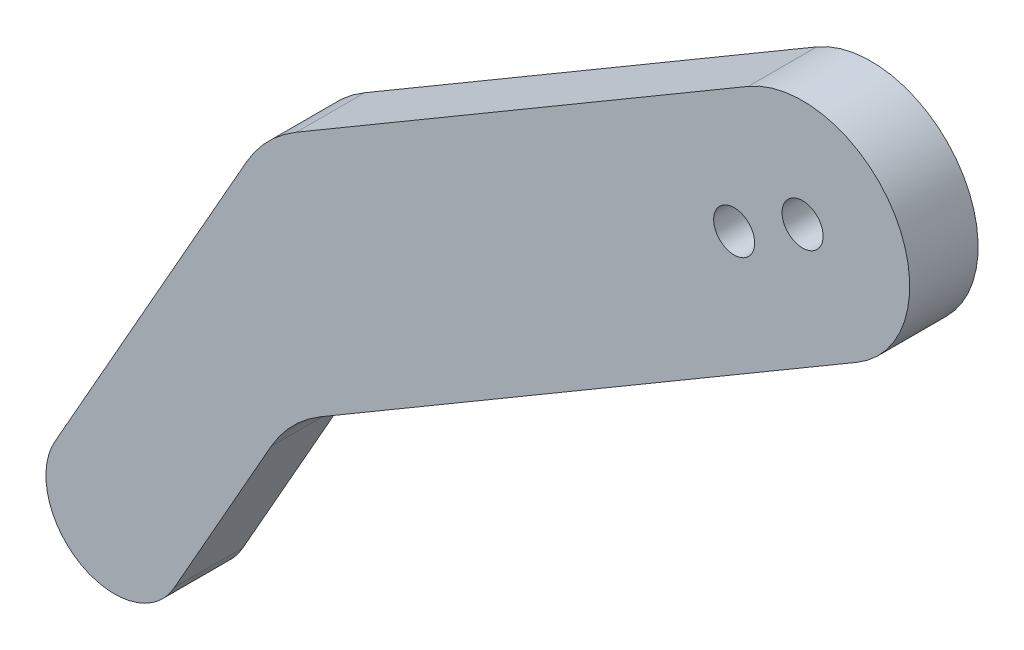
ISO-10303-21;
HEADER;
FILE_DESCRIPTION(('STEP AP214'),'2;1');
FILE_NAME('part.step','',(''),(''),'','','');
FILE_SCHEMA(('AUTOMOTIVE_DESIGN { 1 0 10303 214 1 1 1 1 }'));
ENDSEC;
DATA;
#1=APPLICATION_CONTEXT('core data for automotive mechanical design processes');
#2=APPLICATION_PROTOCOL_DEFINITION('international standard','automotive_design',2000,#1);
#3=PRODUCT_CONTEXT('',#1,'mechanical');
#4=PRODUCT('Part','Part','',(#3));
#5=PRODUCT_RELATED_PRODUCT_CATEGORY('part','',(#4));
#6=PRODUCT_DEFINITION_FORMATION('','',#4);
#7=PRODUCT_DEFINITION_CONTEXT('part definition',#1,'design');
#8=PRODUCT_DEFINITION('design','',#6,#7);
#9=PRODUCT_DEFINITION_SHAPE('','',#8);
#10=(LENGTH_UNIT() NAMED_UNIT(*) SI_UNIT(.MILLI.,.METRE.));
#11=(NAMED_UNIT(*) PLANE_ANGLE_UNIT() SI_UNIT($,.RADIAN.));
#12=(NAMED_UNIT(*) SI_UNIT($,.STERADIAN.) SOLID_ANGLE_UNIT());
#13=UNCERTAINTY_MEASURE_WITH_UNIT(LENGTH_MEASURE(1.E-05),#10,'distance_accuracy_value','');
#14=(GEOMETRIC_REPRESENTATION_CONTEXT(3) GLOBAL_UNCERTAINTY_ASSIGNED_CONTEXT((#13)) GLOBAL_UNIT_ASSIGNED_CONTEXT((#10,
#11,#12)) REPRESENTATION_CONTEXT('',''));
#15=CARTESIAN_POINT('',(0.,0.,0.));
#16=DIRECTION('',(0.,0.,1.));
#17=DIRECTION('',(1.,0.,0.));
#18=AXIS2_PLACEMENT_3D('',#15,#16,#17);
#19=CARTESIAN_POINT('',(8.69918007203384,-4.93196371380907,5.));
#20=DIRECTION('',(-0.869918007203384,0.493196371380907,0.));
#21=DIRECTION('',(-0.493196371380907,-0.869918007203384,0.));
#22=AXIS2_PLACEMENT_3D('',#19,#20,#21);
#23=PLANE('',#22);
#24=DIRECTION('',(0.493196371380907,0.869918007203384,0.));
#25=VECTOR('',#24,1.);
#26=CARTESIAN_POINT('',(8.69918007203384,-4.93196371380907,0.));
#27=LINE('',#26,#25);
#28=CARTESIAN_POINT('',(8.69918007203384,-4.93196371380907,0.));
#29=VERTEX_POINT('',#28);
#30=CARTESIAN_POINT('',(15.7620026912945,7.52570413353407,0.));
#31=VERTEX_POINT('',#30);
#32=EDGE_CURVE('E136',#29,#31,#27,.T.);
#33=ORIENTED_EDGE('',*,*,#32,.T.);
#34=DIRECTION('',(0.,0.,-1.));
#35=VECTOR('',#34,1.);
#36=CARTESIAN_POINT('',(15.7620026912945,7.52570413353407,5.));
#37=LINE('',#36,#35);
#38=CARTESIAN_POINT('',(15.7620026912945,7.52570413353407,5.));
#39=VERTEX_POINT('',#38);
#40=EDGE_CURVE('E11',#39,#31,#37,.T.);
#41=ORIENTED_EDGE('',*,*,#40,.F.);
#42=DIRECTION('',(0.493196371380907,0.869918007203384,0.));
#43=VECTOR('',#42,1.);
#44=CARTESIAN_POINT('',(8.69918007203384,-4.93196371380907,5.));
#45=LINE('',#44,#43);
#46=CARTESIAN_POINT('',(8.69918007203384,-4.93196371380907,5.));
#47=VERTEX_POINT('',#46);
#48=EDGE_CURVE('E155',#47,#39,#45,.T.);
#49=ORIENTED_EDGE('',*,*,#48,.F.);
#50=DIRECTION('',(0.,0.,-1.));
#51=VECTOR('',#50,1.);
#52=CARTESIAN_POINT('',(8.69918007203384,-4.93196371380907,5.));
#53=LINE('',#52,#51);
#54=EDGE_CURVE('E132',#47,#29,#53,.T.);
#55=ORIENTED_EDGE('',*,*,#54,.T.);
#56=EDGE_LOOP('',(#33,#41,#49,#55));
#57=FACE_BOUND('',#56,.T.);
#58=ADVANCED_FACE('F39',(#57),#23,.F.);
#59=CARTESIAN_POINT('',(24.4611827633284,2.593740419725,5.));
#60=DIRECTION('',(0.,0.,-1.));
#61=DIRECTION('',(-1.,0.,0.));
#62=AXIS2_PLACEMENT_3D('',#59,#60,#61);
#63=CYLINDRICAL_SURFACE('',#62,10.);
#64=CARTESIAN_POINT('',(24.4611827633284,2.593740419725,0.));
#65=DIRECTION('',(0.,0.,1.));
#66=DIRECTION('',(1.,0.,0.));
#67=AXIS2_PLACEMENT_3D('',#64,#65,#66);
#68=CIRCLE('',#67,10.);
#69=CARTESIAN_POINT('',(19.3934536857563,11.2145363224436,0.));
#70=VERTEX_POINT('',#69);
#71=EDGE_CURVE('E139',#31,#70,#68,.F.);
#72=ORIENTED_EDGE('',*,*,#71,.T.);
#73=DIRECTION('',(0.,0.,-1.));
#74=VECTOR('',#73,1.);
#75=CARTESIAN_POINT('',(19.3934536857563,11.2145363224436,5.));
#76=LINE('',#75,#74);
#77=CARTESIAN_POINT('',(19.3934536857563,11.2145363224436,5.));
#78=VERTEX_POINT('',#77);
#79=EDGE_CURVE('E48',#78,#70,#76,.T.);
#80=ORIENTED_EDGE('',*,*,#79,.F.);
#81=CARTESIAN_POINT('',(24.4611827633284,2.593740419725,5.));
#82=DIRECTION('',(0.,0.,1.));
#83=DIRECTION('',(1.,0.,0.));
#84=AXIS2_PLACEMENT_3D('',#81,#82,#83);
#85=CIRCLE('',#84,10.);
#86=EDGE_CURVE('E96',#39,#78,#85,.F.);
#87=ORIENTED_EDGE('',*,*,#86,.F.);
#88=ORIENTED_EDGE('',*,*,#40,.T.);
#89=EDGE_LOOP('',(#72,#80,#87,#88));
#90=FACE_BOUND('',#89,.T.);
#91=ADVANCED_FACE('F205',(#90),#63,.F.);
#92=CARTESIAN_POINT('',(0.0812124047382273,-0.138151735284289,5.));
#93=DIRECTION('',(-0.50677290775721,0.862079590271863,0.));
#94=DIRECTION('',(-0.862079590271862,-0.50677290775721,0.));
#95=AXIS2_PLACEMENT_3D('',#92,#93,#94);
#96=PLANE('',#95);
#97=DIRECTION('',(0.862079590271863,0.50677290775721,0.));
#98=VECTOR('',#97,1.);
#99=CARTESIAN_POINT('',(0.0812124047382273,-0.138151735284289,0.));
#100=LINE('',#99,#98);
#101=CARTESIAN_POINT('',(58.5705431889295,34.2447620568523,0.));
#102=VERTEX_POINT('',#101);
#103=EDGE_CURVE('E142',#70,#102,#100,.T.);
#104=ORIENTED_EDGE('',*,*,#103,.T.);
#105=DIRECTION('',(0.,0.,-1.));
#106=VECTOR('',#105,1.);
#107=CARTESIAN_POINT('',(58.5705431889295,34.2447620568523,5.));
#108=LINE('',#107,#106);
#109=CARTESIAN_POINT('',(58.5705431889295,34.2447620568523,5.));
#110=VERTEX_POINT('',#109);
#111=EDGE_CURVE('E161',#110,#102,#108,.T.);
#112=ORIENTED_EDGE('',*,*,#111,.F.);
#113=DIRECTION('',(0.862079590271863,0.50677290775721,0.));
#114=VECTOR('',#113,1.);
#115=CARTESIAN_POINT('',(0.0812124047382273,-0.138151735284289,5.));
#116=LINE('',#115,#114);
#117=EDGE_CURVE('E178',#78,#110,#116,.T.);
#118=ORIENTED_EDGE('',*,*,#117,.F.);
#119=ORIENTED_EDGE('',*,*,#79,.T.);
#120=EDGE_LOOP('',(#104,#112,#118,#119));
#121=FACE_BOUND('',#120,.T.);
#122=ADVANCED_FACE('F209',(#121),#96,.F.);
#123=CARTESIAN_POINT('',(54.602446951442,40.9949547491014,5.));
#124=DIRECTION('',(0.,0.,-1.));
#125=DIRECTION('',(-1.,0.,0.));
#126=AXIS2_PLACEMENT_3D('',#123,#124,#125);
#127=CYLINDRICAL_SURFACE('',#126,7.8301270189222);
#128=CARTESIAN_POINT('',(54.602446951442,40.9949547491014,0.));
#129=DIRECTION('',(0.,0.,1.));
#130=DIRECTION('',(1.,0.,0.));
#131=AXIS2_PLACEMENT_3D('',#128,#129,#130);
#132=CIRCLE('',#131,7.8301270189222);
#133=CARTESIAN_POINT('',(50.6343507139545,47.7451474413505,0.));
#134=VERTEX_POINT('',#133);
#135=EDGE_CURVE('E145',#134,#102,#132,.F.);
#136=ORIENTED_EDGE('',*,*,#135,.F.);
#137=DIRECTION('',(0.,0.,-1.));
#138=VECTOR('',#137,1.);
#139=CARTESIAN_POINT('',(50.6343507139545,47.7451474413505,5.));
#140=LINE('',#139,#138);
#141=CARTESIAN_POINT('',(50.6343507139545,47.7451474413505,5.));
#142=VERTEX_POINT('',#141);
#143=EDGE_CURVE('E159',#142,#134,#140,.T.);
#144=ORIENTED_EDGE('',*,*,#143,.F.);
#145=CARTESIAN_POINT('',(54.602446951442,40.9949547491014,5.));
#146=DIRECTION('',(0.,0.,1.));
#147=DIRECTION('',(1.,0.,0.));
#148=AXIS2_PLACEMENT_3D('',#145,#146,#147);
#149=CIRCLE('',#148,7.8301270189222);
#150=EDGE_CURVE('E180',#142,#110,#149,.F.);
#151=ORIENTED_EDGE('',*,*,#150,.T.);
#152=ORIENTED_EDGE('',*,*,#111,.T.);
#153=EDGE_LOOP('',(#136,#144,#151,#152));
#154=FACE_BOUND('',#153,.T.);
#155=ADVANCED_FACE('F213',(#154),#127,.T.);
#156=CARTESIAN_POINT('',(-7.85498007023677,13.3622336492139,5.));
#157=DIRECTION('',(-0.50677290775721,0.862079590271862,0.));
#158=DIRECTION('',(-0.862079590271862,-0.50677290775721,0.));
#159=AXIS2_PLACEMENT_3D('',#156,#157,#158);
#160=PLANE('',#159);
#161=DIRECTION('',(0.862079590271862,0.50677290775721,0.));
#162=VECTOR('',#161,1.);
#163=CARTESIAN_POINT('',(-7.85498007023677,13.3622336492139,0.));
#164=LINE('',#163,#162);
#165=CARTESIAN_POINT('',(17.5990228130551,28.3253521371001,0.));
#166=VERTEX_POINT('',#165);
#167=EDGE_CURVE('E148',#166,#134,#164,.T.);
#168=ORIENTED_EDGE('',*,*,#167,.F.);
#169=DIRECTION('',(0.,0.,-1.));
#170=VECTOR('',#169,1.);
#171=CARTESIAN_POINT('',(17.5990228130551,28.3253521371001,5.));
#172=LINE('',#171,#170);
#173=CARTESIAN_POINT('',(17.5990228130551,28.3253521371001,5.));
#174=VERTEX_POINT('',#173);
#175=EDGE_CURVE('E121',#174,#166,#172,.T.);
#176=ORIENTED_EDGE('',*,*,#175,.F.);
#177=DIRECTION('',(0.862079590271862,0.50677290775721,0.));
#178=VECTOR('',#177,1.);
#179=CARTESIAN_POINT('',(-7.85498007023677,13.3622336492139,5.));
#180=LINE('',#179,#178);
#181=EDGE_CURVE('E128',#174,#142,#180,.T.);
#182=ORIENTED_EDGE('',*,*,#181,.T.);
#183=ORIENTED_EDGE('',*,*,#143,.T.);
#184=EDGE_LOOP('',(#168,#176,#182,#183));
#185=FACE_BOUND('',#184,.T.);
#186=ADVANCED_FACE('F184',(#185),#160,.T.);
#187=CARTESIAN_POINT('',(22.6667518906272,19.7045562343814,5.));
#188=DIRECTION('',(0.,0.,-1.));
#189=DIRECTION('',(-1.,0.,0.));
#190=AXIS2_PLACEMENT_3D('',#187,#188,#189);
#191=CYLINDRICAL_SURFACE('',#190,10.);
#192=CARTESIAN_POINT('',(22.6667518906272,19.7045562343814,0.));
#193=DIRECTION('',(0.,0.,1.));
#194=DIRECTION('',(1.,0.,0.));
#195=AXIS2_PLACEMENT_3D('',#192,#193,#194);
#196=CIRCLE('',#195,10.);
#197=CARTESIAN_POINT('',(13.9675718185934,24.6365199481905,0.));
#198=VERTEX_POINT('',#197);
#199=EDGE_CURVE('E116',#198,#166,#196,.F.);
#200=ORIENTED_EDGE('',*,*,#199,.F.);
#201=DIRECTION('',(0.,0.,-1.));
#202=VECTOR('',#201,1.);
#203=CARTESIAN_POINT('',(13.9675718185934,24.6365199481905,5.));
#204=LINE('',#203,#202);
#205=CARTESIAN_POINT('',(13.9675718185934,24.6365199481905,5.));
#206=VERTEX_POINT('',#205);
#207=EDGE_CURVE('E111',#206,#198,#204,.T.);
#208=ORIENTED_EDGE('',*,*,#207,.F.);
#209=CARTESIAN_POINT('',(22.6667518906272,19.7045562343814,5.));
#210=DIRECTION('',(0.,0.,1.));
#211=DIRECTION('',(1.,0.,0.));
#212=AXIS2_PLACEMENT_3D('',#209,#210,#211);
#213=CIRCLE('',#212,10.);
#214=EDGE_CURVE('E114',#206,#174,#213,.F.);
#215=ORIENTED_EDGE('',*,*,#214,.T.);
#216=ORIENTED_EDGE('',*,*,#175,.T.);
#217=EDGE_LOOP('',(#200,#208,#215,#216));
#218=FACE_BOUND('',#217,.T.);
#219=ADVANCED_FACE('F113',(#218),#191,.T.);
#220=CARTESIAN_POINT('',(0.,0.,5.));
#221=DIRECTION('',(-0.869918007203384,0.493196371380907,0.));
#222=DIRECTION('',(-0.493196371380907,-0.869918007203384,0.));
#223=AXIS2_PLACEMENT_3D('',#220,#221,#222);
#224=PLANE('',#223);
#225=DIRECTION('',(0.493196371380907,0.869918007203384,0.));
#226=VECTOR('',#225,1.);
#227=CARTESIAN_POINT('',(0.,0.,0.));
#228=LINE('',#227,#226);
#229=CARTESIAN_POINT('',(0.,0.,0.));
#230=VERTEX_POINT('',#229);
#231=EDGE_CURVE('E152',#230,#198,#228,.T.);
#232=ORIENTED_EDGE('',*,*,#231,.F.);
#233=DIRECTION('',(0.,0.,-1.));
#234=VECTOR('',#233,1.);
#235=CARTESIAN_POINT('',(0.,0.,5.));
#236=LINE('',#235,#234);
#237=CARTESIAN_POINT('',(0.,0.,5.));
#238=VERTEX_POINT('',#237);
#239=EDGE_CURVE('E85',#238,#230,#236,.T.);
#240=ORIENTED_EDGE('',*,*,#239,.F.);
#241=DIRECTION('',(0.493196371380907,0.869918007203384,0.));
#242=VECTOR('',#241,1.);
#243=CARTESIAN_POINT('',(0.,0.,5.));
#244=LINE('',#243,#242);
#245=EDGE_CURVE('E125',#238,#206,#244,.T.);
#246=ORIENTED_EDGE('',*,*,#245,.T.);
#247=ORIENTED_EDGE('',*,*,#207,.T.);
#248=EDGE_LOOP('',(#232,#240,#246,#247));
#249=FACE_BOUND('',#248,.T.);
#250=ADVANCED_FACE('F130',(#249),#224,.T.);
#251=CARTESIAN_POINT('',(4.30532765313558,-2.54405348545767,5.));
#252=DIRECTION('',(0.,0.,-1.));
#253=DIRECTION('',(-1.,0.,0.));
#254=AXIS2_PLACEMENT_3D('',#251,#252,#253);
#255=CYLINDRICAL_SURFACE('',#254,5.00080536891042);
#256=CARTESIAN_POINT('',(4.30532765313558,-2.54405348545767,0.));
#257=DIRECTION('',(0.,0.,1.));
#258=DIRECTION('',(1.,0.,0.));
#259=AXIS2_PLACEMENT_3D('',#256,#257,#258);
#260=CIRCLE('',#259,5.00080536891042);
#261=EDGE_CURVE('E88',#230,#29,#260,.T.);
#262=ORIENTED_EDGE('',*,*,#261,.T.);
#263=ORIENTED_EDGE('',*,*,#54,.F.);
#264=CARTESIAN_POINT('',(4.30532765313558,-2.54405348545767,5.));
#265=DIRECTION('',(0.,0.,1.));
#266=DIRECTION('',(1.,0.,0.));
#267=AXIS2_PLACEMENT_3D('',#264,#265,#266);
#268=CIRCLE('',#267,5.00080536891042);
#269=EDGE_CURVE('E57',#238,#47,#268,.T.);
#270=ORIENTED_EDGE('',*,*,#269,.F.);
#271=ORIENTED_EDGE('',*,*,#239,.T.);
#272=EDGE_LOOP('',(#262,#263,#270,#271));
#273=FACE_BOUND('',#272,.T.);
#274=ADVANCED_FACE('F193',(#273),#255,.T.);
#275=CARTESIAN_POINT('',(0.,0.,5.));
#276=DIRECTION('',(0.,0.,1.));
#277=DIRECTION('',(1.,0.,0.));
#278=AXIS2_PLACEMENT_3D('',#275,#276,#277);
#279=PLANE('',#278);
#280=CARTESIAN_POINT('',(49.602446951442,38.0557081094878,5.));
#281=DIRECTION('',(0.,0.,1.));
#282=DIRECTION('',(1.,0.,0.));
#283=AXIS2_PLACEMENT_3D('',#280,#281,#282);
#284=CIRCLE('',#283,1.5);
#285=CARTESIAN_POINT('',(51.102446951442,38.0557081094878,5.));
#286=VERTEX_POINT('',#285);
#287=EDGE_CURVE('E173',#286,#286,#284,.T.);
#288=ORIENTED_EDGE('',*,*,#287,.F.);
#289=EDGE_LOOP('',(#288));
#290=FACE_BOUND('',#289,.T.);
#291=CARTESIAN_POINT('',(54.602446951442,40.9949547491014,5.));
#292=DIRECTION('',(0.,0.,1.));
#293=DIRECTION('',(1.,0.,0.));
#294=AXIS2_PLACEMENT_3D('',#291,#292,#293);
#295=CIRCLE('',#294,1.5);
#296=CARTESIAN_POINT('',(56.102446951442,40.9949547491014,5.));
#297=VERTEX_POINT('',#296);
#298=EDGE_CURVE('E165',#297,#297,#295,.T.);
#299=ORIENTED_EDGE('',*,*,#298,.F.);
#300=EDGE_LOOP('',(#299));
#301=FACE_BOUND('',#300,.T.);
#302=ORIENTED_EDGE('',*,*,#48,.T.);
#303=ORIENTED_EDGE('',*,*,#86,.T.);
#304=ORIENTED_EDGE('',*,*,#117,.T.);
#305=ORIENTED_EDGE('',*,*,#150,.F.);
#306=ORIENTED_EDGE('',*,*,#181,.F.);
#307=ORIENTED_EDGE('',*,*,#214,.F.);
#308=ORIENTED_EDGE('',*,*,#245,.F.);
#309=ORIENTED_EDGE('',*,*,#269,.T.);
#310=EDGE_LOOP('',(#302,#303,#304,#305,#306,#307,#308,#309));
#311=FACE_BOUND('',#310,.T.);
#312=ADVANCED_FACE('F124',(#290,#301,#311),#279,.T.);
#313=CARTESIAN_POINT('',(0.,0.,0.));
#314=DIRECTION('',(0.,0.,1.));
#315=DIRECTION('',(1.,0.,0.));
#316=AXIS2_PLACEMENT_3D('',#313,#314,#315);
#317=PLANE('',#316);
#318=CARTESIAN_POINT('',(49.602446951442,38.0557081094878,0.));
#319=DIRECTION('',(0.,0.,1.));
#320=DIRECTION('',(1.,0.,0.));
#321=AXIS2_PLACEMENT_3D('',#318,#319,#320);
#322=CIRCLE('',#321,1.5);
#323=CARTESIAN_POINT('',(51.102446951442,38.0557081094878,0.));
#324=VERTEX_POINT('',#323);
#325=EDGE_CURVE('E42',#324,#324,#322,.T.);
#326=ORIENTED_EDGE('',*,*,#325,.T.);
#327=EDGE_LOOP('',(#326));
#328=FACE_BOUND('',#327,.T.);
#329=CARTESIAN_POINT('',(54.602446951442,40.9949547491014,0.));
#330=DIRECTION('',(0.,0.,1.));
#331=DIRECTION('',(1.,0.,0.));
#332=AXIS2_PLACEMENT_3D('',#329,#330,#331);
#333=CIRCLE('',#332,1.5);
#334=CARTESIAN_POINT('',(56.102446951442,40.9949547491014,0.));
#335=VERTEX_POINT('',#334);
#336=EDGE_CURVE('E140',#335,#335,#333,.T.);
#337=ORIENTED_EDGE('',*,*,#336,.T.);
#338=EDGE_LOOP('',(#337));
#339=FACE_BOUND('',#338,.T.);
#340=ORIENTED_EDGE('',*,*,#32,.F.);
#341=ORIENTED_EDGE('',*,*,#261,.F.);
#342=ORIENTED_EDGE('',*,*,#231,.T.);
#343=ORIENTED_EDGE('',*,*,#199,.T.);
#344=ORIENTED_EDGE('',*,*,#167,.T.);
#345=ORIENTED_EDGE('',*,*,#135,.T.);
#346=ORIENTED_EDGE('',*,*,#103,.F.);
#347=ORIENTED_EDGE('',*,*,#71,.F.);
#348=EDGE_LOOP('',(#340,#341,#342,#343,#344,#345,#346,#347));
#349=FACE_BOUND('',#348,.T.);
#350=ADVANCED_FACE('F188',(#328,#339,#349),#317,.F.);
#351=CARTESIAN_POINT('',(54.602446951442,40.9949547491014,-2.));
#352=DIRECTION('',(0.,0.,1.));
#353=DIRECTION('',(1.,0.,0.));
#354=AXIS2_PLACEMENT_3D('',#351,#352,#353);
#355=CYLINDRICAL_SURFACE('',#354,1.5);
#356=ORIENTED_EDGE('',*,*,#298,.T.);
#357=EDGE_LOOP('',(#356));
#358=FACE_BOUND('',#357,.T.);
#359=ORIENTED_EDGE('',*,*,#336,.F.);
#360=EDGE_LOOP('',(#359));
#361=FACE_BOUND('',#360,.T.);
#362=ADVANCED_FACE('F250',(#358,#361),#355,.F.);
#363=CARTESIAN_POINT('',(49.602446951442,38.0557081094878,-2.));
#364=DIRECTION('',(0.,0.,1.));
#365=DIRECTION('',(1.,0.,0.));
#366=AXIS2_PLACEMENT_3D('',#363,#364,#365);
#367=CYLINDRICAL_SURFACE('',#366,1.5);
#368=ORIENTED_EDGE('',*,*,#287,.T.);
#369=EDGE_LOOP('',(#368));
#370=FACE_BOUND('',#369,.T.);
#371=ORIENTED_EDGE('',*,*,#325,.F.);
#372=EDGE_LOOP('',(#371));
#373=FACE_BOUND('',#372,.T.);
#374=ADVANCED_FACE('F259',(#370,#373),#367,.F.);
#375=CLOSED_SHELL('',(#58,#91,#122,#155,#186,#219,#250,#274,#312,#350,#362,#374));
#376=MANIFOLD_SOLID_BREP('B2',#375);
#377=ADVANCED_BREP_SHAPE_REPRESENTATION('',(#18,#376),#14);
#378=SHAPE_DEFINITION_REPRESENTATION(#9,#377);
ENDSEC;
END-ISO-10303-21;
